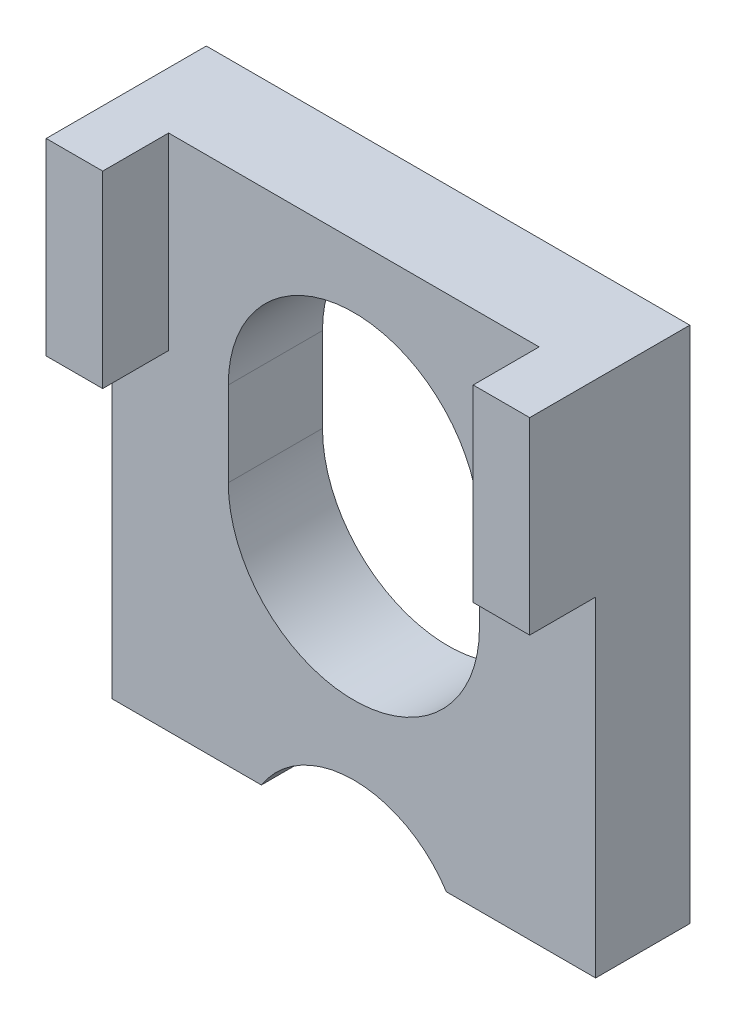
ISO-10303-21;
HEADER;
FILE_DESCRIPTION(('STEP AP214'),'2;1');
FILE_NAME('part.step','',(''),(''),'','','');
FILE_SCHEMA(('AUTOMOTIVE_DESIGN { 1 0 10303 214 1 1 1 1 }'));
ENDSEC;
DATA;
#1=APPLICATION_CONTEXT('core data for automotive mechanical design processes');
#2=APPLICATION_PROTOCOL_DEFINITION('international standard','automotive_design',2000,#1);
#3=PRODUCT_CONTEXT('',#1,'mechanical');
#4=PRODUCT('Part','Part','',(#3));
#5=PRODUCT_RELATED_PRODUCT_CATEGORY('part','',(#4));
#6=PRODUCT_DEFINITION_FORMATION('','',#4);
#7=PRODUCT_DEFINITION_CONTEXT('part definition',#1,'design');
#8=PRODUCT_DEFINITION('design','',#6,#7);
#9=PRODUCT_DEFINITION_SHAPE('','',#8);
#10=(LENGTH_UNIT() NAMED_UNIT(*) SI_UNIT(.MILLI.,.METRE.));
#11=(NAMED_UNIT(*) PLANE_ANGLE_UNIT() SI_UNIT($,.RADIAN.));
#12=(NAMED_UNIT(*) SI_UNIT($,.STERADIAN.) SOLID_ANGLE_UNIT());
#13=UNCERTAINTY_MEASURE_WITH_UNIT(LENGTH_MEASURE(1.E-05),#10,'distance_accuracy_value','');
#14=(GEOMETRIC_REPRESENTATION_CONTEXT(3) GLOBAL_UNCERTAINTY_ASSIGNED_CONTEXT((#13)) GLOBAL_UNIT_ASSIGNED_CONTEXT((#10,
#11,#12)) REPRESENTATION_CONTEXT('',''));
#15=CARTESIAN_POINT('',(0.,0.,0.));
#16=DIRECTION('',(0.,0.,1.));
#17=DIRECTION('',(1.,0.,0.));
#18=AXIS2_PLACEMENT_3D('',#15,#16,#17);
#19=CARTESIAN_POINT('',(0.,-4.65897627091936,3.));
#20=DIRECTION('',(0.,0.,-1.));
#21=DIRECTION('',(-1.,0.,0.));
#22=AXIS2_PLACEMENT_3D('',#19,#20,#21);
#23=PLANE('',#22);
#24=CARTESIAN_POINT('',(0.,7.73749960693732,3.));
#25=DIRECTION('',(0.,0.,1.));
#26=DIRECTION('',(1.,0.,0.));
#27=AXIS2_PLACEMENT_3D('',#24,#25,#26);
#28=CIRCLE('',#27,4.);
#29=CARTESIAN_POINT('',(4.,7.73749960693732,3.));
#30=VERTEX_POINT('',#29);
#31=CARTESIAN_POINT('',(-4.,7.73749960693732,3.));
#32=VERTEX_POINT('',#31);
#33=EDGE_CURVE('E211',#30,#32,#28,.T.);
#34=ORIENTED_EDGE('',*,*,#33,.F.);
#35=DIRECTION('',(0.,1.,0.));
#36=VECTOR('',#35,1.);
#37=CARTESIAN_POINT('',(4.,7.73749960693732,3.));
#38=LINE('',#37,#36);
#39=CARTESIAN_POINT('',(4.,5.04102372908064,3.));
#40=VERTEX_POINT('',#39);
#41=EDGE_CURVE('E219',#40,#30,#38,.T.);
#42=ORIENTED_EDGE('',*,*,#41,.F.);
#43=CARTESIAN_POINT('',(0.,5.04102372908064,3.));
#44=DIRECTION('',(0.,0.,1.));
#45=DIRECTION('',(1.,0.,0.));
#46=AXIS2_PLACEMENT_3D('',#43,#44,#45);
#47=CIRCLE('',#46,4.);
#48=CARTESIAN_POINT('',(-4.,5.04102372908064,3.));
#49=VERTEX_POINT('',#48);
#50=EDGE_CURVE('E216',#49,#40,#47,.T.);
#51=ORIENTED_EDGE('',*,*,#50,.F.);
#52=DIRECTION('',(0.,-1.,0.));
#53=VECTOR('',#52,1.);
#54=CARTESIAN_POINT('',(-4.,7.73749960693732,3.));
#55=LINE('',#54,#53);
#56=EDGE_CURVE('E213',#32,#49,#55,.T.);
#57=ORIENTED_EDGE('',*,*,#56,.F.);
#58=EDGE_LOOP('',(#34,#42,#51,#57));
#59=FACE_BOUND('',#58,.T.);
#60=DIRECTION('',(0.,-1.,0.));
#61=VECTOR('',#60,1.);
#62=CARTESIAN_POINT('',(5.9,13.7374996069373,3.));
#63=LINE('',#62,#61);
#64=CARTESIAN_POINT('',(5.9,13.7374996069373,3.));
#65=VERTEX_POINT('',#64);
#66=CARTESIAN_POINT('',(5.9,7.73749960693732,3.));
#67=VERTEX_POINT('',#66);
#68=EDGE_CURVE('E173',#65,#67,#63,.T.);
#69=ORIENTED_EDGE('',*,*,#68,.F.);
#70=DIRECTION('',(-1.,0.,0.));
#71=VECTOR('',#70,1.);
#72=CARTESIAN_POINT('',(-7.7,13.7374996069373,3.));
#73=LINE('',#72,#71);
#74=CARTESIAN_POINT('',(-5.9,13.7374996069373,3.));
#75=VERTEX_POINT('',#74);
#76=EDGE_CURVE('E252',#65,#75,#73,.T.);
#77=ORIENTED_EDGE('',*,*,#76,.T.);
#78=DIRECTION('',(0.,1.,0.));
#79=VECTOR('',#78,1.);
#80=CARTESIAN_POINT('',(-5.9,13.7374996069373,3.));
#81=LINE('',#80,#79);
#82=CARTESIAN_POINT('',(-5.9,7.73749960693732,3.));
#83=VERTEX_POINT('',#82);
#84=EDGE_CURVE('E190',#83,#75,#81,.T.);
#85=ORIENTED_EDGE('',*,*,#84,.F.);
#86=DIRECTION('',(1.,0.,0.));
#87=VECTOR('',#86,1.);
#88=CARTESIAN_POINT('',(-7.7,7.73749960693732,3.));
#89=LINE('',#88,#87);
#90=CARTESIAN_POINT('',(-7.7,7.73749960693732,3.));
#91=VERTEX_POINT('',#90);
#92=EDGE_CURVE('E185',#91,#83,#89,.T.);
#93=ORIENTED_EDGE('',*,*,#92,.F.);
#94=DIRECTION('',(0.,-1.,0.));
#95=VECTOR('',#94,1.);
#96=CARTESIAN_POINT('',(-7.7,13.7374996069373,3.));
#97=LINE('',#96,#95);
#98=CARTESIAN_POINT('',(-7.7,-2.76956685137603,3.));
#99=VERTEX_POINT('',#98);
#100=EDGE_CURVE('E242',#91,#99,#97,.T.);
#101=ORIENTED_EDGE('',*,*,#100,.T.);
#102=DIRECTION('',(1.,0.,0.));
#103=VECTOR('',#102,1.);
#104=CARTESIAN_POINT('',(-7.7,-2.76956685137603,3.));
#105=LINE('',#104,#103);
#106=CARTESIAN_POINT('',(-2.94620638200058,-2.76956685137603,3.));
#107=VERTEX_POINT('',#106);
#108=EDGE_CURVE('E244',#99,#107,#105,.T.);
#109=ORIENTED_EDGE('',*,*,#108,.T.);
#110=CARTESIAN_POINT('',(0.,-4.65897627091936,3.));
#111=DIRECTION('',(0.,0.,-1.));
#112=DIRECTION('',(-1.,0.,0.));
#113=AXIS2_PLACEMENT_3D('',#110,#111,#112);
#114=CIRCLE('',#113,3.5);
#115=CARTESIAN_POINT('',(2.94620638200058,-2.76956685137603,3.));
#116=VERTEX_POINT('',#115);
#117=EDGE_CURVE('E247',#107,#116,#114,.T.);
#118=ORIENTED_EDGE('',*,*,#117,.T.);
#119=DIRECTION('',(1.,0.,0.));
#120=VECTOR('',#119,1.);
#121=CARTESIAN_POINT('',(7.7,-2.76956685137603,3.));
#122=LINE('',#121,#120);
#123=CARTESIAN_POINT('',(7.7,-2.76956685137603,3.));
#124=VERTEX_POINT('',#123);
#125=EDGE_CURVE('E249',#116,#124,#122,.T.);
#126=ORIENTED_EDGE('',*,*,#125,.T.);
#127=DIRECTION('',(0.,1.,0.));
#128=VECTOR('',#127,1.);
#129=CARTESIAN_POINT('',(7.7,-0.0396047922675049,3.));
#130=LINE('',#129,#128);
#131=CARTESIAN_POINT('',(7.7,7.73749960693732,3.));
#132=VERTEX_POINT('',#131);
#133=EDGE_CURVE('E53',#124,#132,#130,.T.);
#134=ORIENTED_EDGE('',*,*,#133,.T.);
#135=DIRECTION('',(1.,0.,0.));
#136=VECTOR('',#135,1.);
#137=CARTESIAN_POINT('',(7.7,7.73749960693732,3.));
#138=LINE('',#137,#136);
#139=EDGE_CURVE('E48',#67,#132,#138,.T.);
#140=ORIENTED_EDGE('',*,*,#139,.F.);
#141=EDGE_LOOP('',(#69,#77,#85,#93,#101,#109,#118,#126,#134,#140));
#142=FACE_BOUND('',#141,.T.);
#143=ADVANCED_FACE('F33',(#59,#142),#23,.F.);
#144=CARTESIAN_POINT('',(0.,-4.65897627091936,0.));
#145=DIRECTION('',(0.,0.,-1.));
#146=DIRECTION('',(-1.,0.,0.));
#147=AXIS2_PLACEMENT_3D('',#144,#145,#146);
#148=PLANE('',#147);
#149=DIRECTION('',(0.,-1.,0.));
#150=VECTOR('',#149,1.);
#151=CARTESIAN_POINT('',(-7.7,-0.0396047922675089,0.));
#152=LINE('',#151,#150);
#153=CARTESIAN_POINT('',(-7.7,13.7374996069373,0.));
#154=VERTEX_POINT('',#153);
#155=CARTESIAN_POINT('',(-7.7,-2.76956685137603,0.));
#156=VERTEX_POINT('',#155);
#157=EDGE_CURVE('E241',#154,#156,#152,.T.);
#158=ORIENTED_EDGE('',*,*,#157,.F.);
#159=DIRECTION('',(-1.,0.,0.));
#160=VECTOR('',#159,1.);
#161=CARTESIAN_POINT('',(-7.7,13.7374996069373,0.));
#162=LINE('',#161,#160);
#163=CARTESIAN_POINT('',(7.7,13.7374996069373,0.));
#164=VERTEX_POINT('',#163);
#165=EDGE_CURVE('E245',#164,#154,#162,.T.);
#166=ORIENTED_EDGE('',*,*,#165,.F.);
#167=DIRECTION('',(0.,1.,0.));
#168=VECTOR('',#167,1.);
#169=CARTESIAN_POINT('',(7.7,13.7374996069373,0.));
#170=LINE('',#169,#168);
#171=CARTESIAN_POINT('',(7.7,-2.76956685137603,0.));
#172=VERTEX_POINT('',#171);
#173=EDGE_CURVE('E152',#172,#164,#170,.T.);
#174=ORIENTED_EDGE('',*,*,#173,.F.);
#175=DIRECTION('',(1.,0.,0.));
#176=VECTOR('',#175,1.);
#177=CARTESIAN_POINT('',(7.7,-2.76956685137603,0.));
#178=LINE('',#177,#176);
#179=CARTESIAN_POINT('',(2.94620638200058,-2.76956685137603,0.));
#180=VERTEX_POINT('',#179);
#181=EDGE_CURVE('E259',#180,#172,#178,.T.);
#182=ORIENTED_EDGE('',*,*,#181,.F.);
#183=CARTESIAN_POINT('',(0.,-4.65897627091936,0.));
#184=DIRECTION('',(0.,0.,-1.));
#185=DIRECTION('',(-1.,0.,0.));
#186=AXIS2_PLACEMENT_3D('',#183,#184,#185);
#187=CIRCLE('',#186,3.5);
#188=CARTESIAN_POINT('',(-2.94620638200058,-2.76956685137603,0.));
#189=VERTEX_POINT('',#188);
#190=EDGE_CURVE('E257',#189,#180,#187,.T.);
#191=ORIENTED_EDGE('',*,*,#190,.F.);
#192=DIRECTION('',(1.,0.,0.));
#193=VECTOR('',#192,1.);
#194=CARTESIAN_POINT('',(-7.7,-2.76956685137603,0.));
#195=LINE('',#194,#193);
#196=EDGE_CURVE('E255',#156,#189,#195,.T.);
#197=ORIENTED_EDGE('',*,*,#196,.F.);
#198=EDGE_LOOP('',(#158,#166,#174,#182,#191,#197));
#199=FACE_BOUND('',#198,.T.);
#200=DIRECTION('',(0.,1.,0.));
#201=VECTOR('',#200,1.);
#202=CARTESIAN_POINT('',(4.,7.73749960693732,0.));
#203=LINE('',#202,#201);
#204=CARTESIAN_POINT('',(4.,5.04102372908064,0.));
#205=VERTEX_POINT('',#204);
#206=CARTESIAN_POINT('',(4.,7.73749960693732,0.));
#207=VERTEX_POINT('',#206);
#208=EDGE_CURVE('E214',#205,#207,#203,.T.);
#209=ORIENTED_EDGE('',*,*,#208,.T.);
#210=CARTESIAN_POINT('',(0.,7.73749960693732,0.));
#211=DIRECTION('',(0.,0.,1.));
#212=DIRECTION('',(1.,0.,0.));
#213=AXIS2_PLACEMENT_3D('',#210,#211,#212);
#214=CIRCLE('',#213,4.);
#215=CARTESIAN_POINT('',(-4.,7.73749960693732,0.));
#216=VERTEX_POINT('',#215);
#217=EDGE_CURVE('E210',#207,#216,#214,.T.);
#218=ORIENTED_EDGE('',*,*,#217,.T.);
#219=DIRECTION('',(0.,-1.,0.));
#220=VECTOR('',#219,1.);
#221=CARTESIAN_POINT('',(-4.,7.73749960693732,0.));
#222=LINE('',#221,#220);
#223=CARTESIAN_POINT('',(-4.,5.04102372908064,0.));
#224=VERTEX_POINT('',#223);
#225=EDGE_CURVE('E224',#216,#224,#222,.T.);
#226=ORIENTED_EDGE('',*,*,#225,.T.);
#227=CARTESIAN_POINT('',(0.,5.04102372908064,0.));
#228=DIRECTION('',(0.,0.,1.));
#229=DIRECTION('',(1.,0.,0.));
#230=AXIS2_PLACEMENT_3D('',#227,#228,#229);
#231=CIRCLE('',#230,4.);
#232=EDGE_CURVE('E227',#224,#205,#231,.T.);
#233=ORIENTED_EDGE('',*,*,#232,.T.);
#234=EDGE_LOOP('',(#209,#218,#226,#233));
#235=FACE_BOUND('',#234,.T.);
#236=ADVANCED_FACE('F281',(#199,#235),#148,.T.);
#237=CARTESIAN_POINT('',(-7.7,-0.0396047922675089,3.));
#238=DIRECTION('',(1.,0.,0.));
#239=DIRECTION('',(0.,0.,-1.));
#240=AXIS2_PLACEMENT_3D('',#237,#238,#239);
#241=PLANE('',#240);
#242=ORIENTED_EDGE('',*,*,#157,.T.);
#243=DIRECTION('',(0.,0.,-1.));
#244=VECTOR('',#243,1.);
#245=CARTESIAN_POINT('',(-7.7,-2.76956685137603,3.));
#246=LINE('',#245,#244);
#247=EDGE_CURVE('E11',#99,#156,#246,.T.);
#248=ORIENTED_EDGE('',*,*,#247,.F.);
#249=ORIENTED_EDGE('',*,*,#100,.F.);
#250=DIRECTION('',(0.,0.,-1.));
#251=VECTOR('',#250,1.);
#252=CARTESIAN_POINT('',(-7.7,7.73749960693732,5.1));
#253=LINE('',#252,#251);
#254=CARTESIAN_POINT('',(-7.7,7.73749960693732,5.1));
#255=VERTEX_POINT('',#254);
#256=EDGE_CURVE('E207',#255,#91,#253,.T.);
#257=ORIENTED_EDGE('',*,*,#256,.F.);
#258=DIRECTION('',(0.,-1.,0.));
#259=VECTOR('',#258,1.);
#260=CARTESIAN_POINT('',(-7.7,13.7374996069373,5.1));
#261=LINE('',#260,#259);
#262=CARTESIAN_POINT('',(-7.7,13.7374996069373,5.1));
#263=VERTEX_POINT('',#262);
#264=EDGE_CURVE('E186',#263,#255,#261,.T.);
#265=ORIENTED_EDGE('',*,*,#264,.F.);
#266=DIRECTION('',(0.,0.,-1.));
#267=VECTOR('',#266,1.);
#268=CARTESIAN_POINT('',(-7.7,13.7374996069373,3.));
#269=LINE('',#268,#267);
#270=EDGE_CURVE('E157',#263,#154,#269,.T.);
#271=ORIENTED_EDGE('',*,*,#270,.T.);
#272=EDGE_LOOP('',(#242,#248,#249,#257,#265,#271));
#273=FACE_BOUND('',#272,.T.);
#274=ADVANCED_FACE('F35',(#273),#241,.F.);
#275=CARTESIAN_POINT('',(-7.7,-2.76956685137603,3.));
#276=DIRECTION('',(0.,1.,0.));
#277=DIRECTION('',(0.,0.,1.));
#278=AXIS2_PLACEMENT_3D('',#275,#276,#277);
#279=PLANE('',#278);
#280=ORIENTED_EDGE('',*,*,#196,.T.);
#281=DIRECTION('',(0.,0.,-1.));
#282=VECTOR('',#281,1.);
#283=CARTESIAN_POINT('',(-2.94620638200058,-2.76956685137603,3.));
#284=LINE('',#283,#282);
#285=EDGE_CURVE('E41',#107,#189,#284,.T.);
#286=ORIENTED_EDGE('',*,*,#285,.F.);
#287=ORIENTED_EDGE('',*,*,#108,.F.);
#288=ORIENTED_EDGE('',*,*,#247,.T.);
#289=EDGE_LOOP('',(#280,#286,#287,#288));
#290=FACE_BOUND('',#289,.T.);
#291=ADVANCED_FACE('F307',(#290),#279,.F.);
#292=CARTESIAN_POINT('',(0.,-4.65897627091936,3.));
#293=DIRECTION('',(0.,0.,-1.));
#294=DIRECTION('',(-1.,0.,0.));
#295=AXIS2_PLACEMENT_3D('',#292,#293,#294);
#296=CYLINDRICAL_SURFACE('',#295,3.5);
#297=ORIENTED_EDGE('',*,*,#190,.T.);
#298=DIRECTION('',(0.,0.,-1.));
#299=VECTOR('',#298,1.);
#300=CARTESIAN_POINT('',(2.94620638200058,-2.76956685137603,3.));
#301=LINE('',#300,#299);
#302=EDGE_CURVE('E267',#116,#180,#301,.T.);
#303=ORIENTED_EDGE('',*,*,#302,.F.);
#304=ORIENTED_EDGE('',*,*,#117,.F.);
#305=ORIENTED_EDGE('',*,*,#285,.T.);
#306=EDGE_LOOP('',(#297,#303,#304,#305));
#307=FACE_BOUND('',#306,.T.);
#308=ADVANCED_FACE('F274',(#307),#296,.F.);
#309=CARTESIAN_POINT('',(7.7,-2.76956685137603,3.));
#310=DIRECTION('',(0.,1.,0.));
#311=DIRECTION('',(-1.,0.,0.));
#312=AXIS2_PLACEMENT_3D('',#309,#310,#311);
#313=PLANE('',#312);
#314=ORIENTED_EDGE('',*,*,#181,.T.);
#315=DIRECTION('',(0.,0.,-1.));
#316=VECTOR('',#315,1.);
#317=CARTESIAN_POINT('',(7.7,-2.76956685137603,3.));
#318=LINE('',#317,#316);
#319=EDGE_CURVE('E156',#124,#172,#318,.T.);
#320=ORIENTED_EDGE('',*,*,#319,.F.);
#321=ORIENTED_EDGE('',*,*,#125,.F.);
#322=ORIENTED_EDGE('',*,*,#302,.T.);
#323=EDGE_LOOP('',(#314,#320,#321,#322));
#324=FACE_BOUND('',#323,.T.);
#325=ADVANCED_FACE('F285',(#324),#313,.F.);
#326=CARTESIAN_POINT('',(7.7,13.7374996069373,3.));
#327=DIRECTION('',(-1.,0.,0.));
#328=DIRECTION('',(0.,-1.,0.));
#329=AXIS2_PLACEMENT_3D('',#326,#327,#328);
#330=PLANE('',#329);
#331=ORIENTED_EDGE('',*,*,#173,.T.);
#332=DIRECTION('',(0.,0.,-1.));
#333=VECTOR('',#332,1.);
#334=CARTESIAN_POINT('',(7.7,13.7374996069373,3.));
#335=LINE('',#334,#333);
#336=CARTESIAN_POINT('',(7.7,13.7374996069373,5.1));
#337=VERTEX_POINT('',#336);
#338=EDGE_CURVE('E145',#337,#164,#335,.T.);
#339=ORIENTED_EDGE('',*,*,#338,.F.);
#340=DIRECTION('',(0.,1.,0.));
#341=VECTOR('',#340,1.);
#342=CARTESIAN_POINT('',(7.7,13.7374996069373,5.1));
#343=LINE('',#342,#341);
#344=CARTESIAN_POINT('',(7.7,7.73749960693732,5.1));
#345=VERTEX_POINT('',#344);
#346=EDGE_CURVE('E150',#345,#337,#343,.T.);
#347=ORIENTED_EDGE('',*,*,#346,.F.);
#348=DIRECTION('',(0.,0.,-1.));
#349=VECTOR('',#348,1.);
#350=CARTESIAN_POINT('',(7.7,7.73749960693732,5.1));
#351=LINE('',#350,#349);
#352=EDGE_CURVE('E178',#345,#132,#351,.T.);
#353=ORIENTED_EDGE('',*,*,#352,.T.);
#354=ORIENTED_EDGE('',*,*,#133,.F.);
#355=ORIENTED_EDGE('',*,*,#319,.T.);
#356=EDGE_LOOP('',(#331,#339,#347,#353,#354,#355));
#357=FACE_BOUND('',#356,.T.);
#358=ADVANCED_FACE('F147',(#357),#330,.F.);
#359=CARTESIAN_POINT('',(-7.7,13.7374996069373,3.));
#360=DIRECTION('',(0.,-1.,0.));
#361=DIRECTION('',(0.,0.,-1.));
#362=AXIS2_PLACEMENT_3D('',#359,#360,#361);
#363=PLANE('',#362);
#364=ORIENTED_EDGE('',*,*,#165,.T.);
#365=ORIENTED_EDGE('',*,*,#270,.F.);
#366=DIRECTION('',(-1.,0.,0.));
#367=VECTOR('',#366,1.);
#368=CARTESIAN_POINT('',(-7.7,13.7374996069373,5.1));
#369=LINE('',#368,#367);
#370=CARTESIAN_POINT('',(-5.9,13.7374996069373,5.1));
#371=VERTEX_POINT('',#370);
#372=EDGE_CURVE('E194',#371,#263,#369,.T.);
#373=ORIENTED_EDGE('',*,*,#372,.F.);
#374=DIRECTION('',(0.,0.,-1.));
#375=VECTOR('',#374,1.);
#376=CARTESIAN_POINT('',(-5.9,13.7374996069373,5.1));
#377=LINE('',#376,#375);
#378=EDGE_CURVE('E197',#371,#75,#377,.T.);
#379=ORIENTED_EDGE('',*,*,#378,.T.);
#380=ORIENTED_EDGE('',*,*,#76,.F.);
#381=DIRECTION('',(0.,0.,-1.));
#382=VECTOR('',#381,1.);
#383=CARTESIAN_POINT('',(5.9,13.7374996069373,5.1));
#384=LINE('',#383,#382);
#385=CARTESIAN_POINT('',(5.9,13.7374996069373,5.1));
#386=VERTEX_POINT('',#385);
#387=EDGE_CURVE('E163',#386,#65,#384,.T.);
#388=ORIENTED_EDGE('',*,*,#387,.F.);
#389=DIRECTION('',(-1.,0.,0.));
#390=VECTOR('',#389,1.);
#391=CARTESIAN_POINT('',(7.7,13.7374996069373,5.1));
#392=LINE('',#391,#390);
#393=EDGE_CURVE('E160',#337,#386,#392,.T.);
#394=ORIENTED_EDGE('',*,*,#393,.F.);
#395=ORIENTED_EDGE('',*,*,#338,.T.);
#396=EDGE_LOOP('',(#364,#365,#373,#379,#380,#388,#394,#395));
#397=FACE_BOUND('',#396,.T.);
#398=ADVANCED_FACE('F161',(#397),#363,.F.);
#399=CARTESIAN_POINT('',(0.,7.73749960693732,3.));
#400=DIRECTION('',(0.,0.,-1.));
#401=DIRECTION('',(-1.,0.,0.));
#402=AXIS2_PLACEMENT_3D('',#399,#400,#401);
#403=CYLINDRICAL_SURFACE('',#402,4.);
#404=ORIENTED_EDGE('',*,*,#217,.F.);
#405=DIRECTION('',(0.,0.,-1.));
#406=VECTOR('',#405,1.);
#407=CARTESIAN_POINT('',(4.,7.73749960693732,3.));
#408=LINE('',#407,#406);
#409=EDGE_CURVE('E221',#30,#207,#408,.T.);
#410=ORIENTED_EDGE('',*,*,#409,.F.);
#411=ORIENTED_EDGE('',*,*,#33,.T.);
#412=DIRECTION('',(0.,0.,-1.));
#413=VECTOR('',#412,1.);
#414=CARTESIAN_POINT('',(-4.,7.73749960693732,3.));
#415=LINE('',#414,#413);
#416=EDGE_CURVE('E238',#32,#216,#415,.T.);
#417=ORIENTED_EDGE('',*,*,#416,.T.);
#418=EDGE_LOOP('',(#404,#410,#411,#417));
#419=FACE_BOUND('',#418,.T.);
#420=ADVANCED_FACE('F323',(#419),#403,.F.);
#421=CARTESIAN_POINT('',(-4.,7.73749960693732,3.));
#422=DIRECTION('',(1.,0.,0.));
#423=DIRECTION('',(0.,1.,0.));
#424=AXIS2_PLACEMENT_3D('',#421,#422,#423);
#425=PLANE('',#424);
#426=ORIENTED_EDGE('',*,*,#225,.F.);
#427=ORIENTED_EDGE('',*,*,#416,.F.);
#428=ORIENTED_EDGE('',*,*,#56,.T.);
#429=DIRECTION('',(0.,0.,-1.));
#430=VECTOR('',#429,1.);
#431=CARTESIAN_POINT('',(-4.,5.04102372908064,3.));
#432=LINE('',#431,#430);
#433=EDGE_CURVE('E236',#49,#224,#432,.T.);
#434=ORIENTED_EDGE('',*,*,#433,.T.);
#435=EDGE_LOOP('',(#426,#427,#428,#434));
#436=FACE_BOUND('',#435,.T.);
#437=ADVANCED_FACE('F351',(#436),#425,.T.);
#438=CARTESIAN_POINT('',(0.,5.04102372908064,3.));
#439=DIRECTION('',(0.,0.,-1.));
#440=DIRECTION('',(-1.,0.,0.));
#441=AXIS2_PLACEMENT_3D('',#438,#439,#440);
#442=CYLINDRICAL_SURFACE('',#441,4.);
#443=ORIENTED_EDGE('',*,*,#232,.F.);
#444=ORIENTED_EDGE('',*,*,#433,.F.);
#445=ORIENTED_EDGE('',*,*,#50,.T.);
#446=DIRECTION('',(0.,0.,-1.));
#447=VECTOR('',#446,1.);
#448=CARTESIAN_POINT('',(4.,5.04102372908064,3.));
#449=LINE('',#448,#447);
#450=EDGE_CURVE('E234',#40,#205,#449,.T.);
#451=ORIENTED_EDGE('',*,*,#450,.T.);
#452=EDGE_LOOP('',(#443,#444,#445,#451));
#453=FACE_BOUND('',#452,.T.);
#454=ADVANCED_FACE('F358',(#453),#442,.F.);
#455=CARTESIAN_POINT('',(4.,7.73749960693732,3.));
#456=DIRECTION('',(-1.,0.,0.));
#457=DIRECTION('',(0.,-1.,0.));
#458=AXIS2_PLACEMENT_3D('',#455,#456,#457);
#459=PLANE('',#458);
#460=ORIENTED_EDGE('',*,*,#208,.F.);
#461=ORIENTED_EDGE('',*,*,#450,.F.);
#462=ORIENTED_EDGE('',*,*,#41,.T.);
#463=ORIENTED_EDGE('',*,*,#409,.T.);
#464=EDGE_LOOP('',(#460,#461,#462,#463));
#465=FACE_BOUND('',#464,.T.);
#466=ADVANCED_FACE('F365',(#465),#459,.T.);
#467=CARTESIAN_POINT('',(-7.7,7.73749960693732,5.1));
#468=DIRECTION('',(0.,1.,0.));
#469=DIRECTION('',(0.,0.,1.));
#470=AXIS2_PLACEMENT_3D('',#467,#468,#469);
#471=PLANE('',#470);
#472=ORIENTED_EDGE('',*,*,#92,.T.);
#473=DIRECTION('',(0.,0.,-1.));
#474=VECTOR('',#473,1.);
#475=CARTESIAN_POINT('',(-5.9,7.73749960693732,5.1));
#476=LINE('',#475,#474);
#477=CARTESIAN_POINT('',(-5.9,7.73749960693732,5.1));
#478=VERTEX_POINT('',#477);
#479=EDGE_CURVE('E204',#478,#83,#476,.T.);
#480=ORIENTED_EDGE('',*,*,#479,.F.);
#481=DIRECTION('',(1.,0.,0.));
#482=VECTOR('',#481,1.);
#483=CARTESIAN_POINT('',(-7.7,7.73749960693732,5.1));
#484=LINE('',#483,#482);
#485=EDGE_CURVE('E189',#255,#478,#484,.T.);
#486=ORIENTED_EDGE('',*,*,#485,.F.);
#487=ORIENTED_EDGE('',*,*,#256,.T.);
#488=EDGE_LOOP('',(#472,#480,#486,#487));
#489=FACE_BOUND('',#488,.T.);
#490=ADVANCED_FACE('F306',(#489),#471,.F.);
#491=CARTESIAN_POINT('',(-5.9,13.7374996069373,5.1));
#492=DIRECTION('',(-1.,0.,0.));
#493=DIRECTION('',(0.,-1.,0.));
#494=AXIS2_PLACEMENT_3D('',#491,#492,#493);
#495=PLANE('',#494);
#496=ORIENTED_EDGE('',*,*,#84,.T.);
#497=ORIENTED_EDGE('',*,*,#378,.F.);
#498=DIRECTION('',(0.,1.,0.));
#499=VECTOR('',#498,1.);
#500=CARTESIAN_POINT('',(-5.9,13.7374996069373,5.1));
#501=LINE('',#500,#499);
#502=EDGE_CURVE('E192',#478,#371,#501,.T.);
#503=ORIENTED_EDGE('',*,*,#502,.F.);
#504=ORIENTED_EDGE('',*,*,#479,.T.);
#505=EDGE_LOOP('',(#496,#497,#503,#504));
#506=FACE_BOUND('',#505,.T.);
#507=ADVANCED_FACE('F294',(#506),#495,.F.);
#508=CARTESIAN_POINT('',(0.,0.,5.1));
#509=DIRECTION('',(0.,0.,1.));
#510=DIRECTION('',(1.,0.,0.));
#511=AXIS2_PLACEMENT_3D('',#508,#509,#510);
#512=PLANE('',#511);
#513=ORIENTED_EDGE('',*,*,#264,.T.);
#514=ORIENTED_EDGE('',*,*,#485,.T.);
#515=ORIENTED_EDGE('',*,*,#502,.T.);
#516=ORIENTED_EDGE('',*,*,#372,.T.);
#517=EDGE_LOOP('',(#513,#514,#515,#516));
#518=FACE_BOUND('',#517,.T.);
#519=ADVANCED_FACE('F300',(#518),#512,.T.);
#520=CARTESIAN_POINT('',(5.9,13.7374996069373,5.1));
#521=DIRECTION('',(1.,0.,0.));
#522=DIRECTION('',(0.,1.,0.));
#523=AXIS2_PLACEMENT_3D('',#520,#521,#522);
#524=PLANE('',#523);
#525=ORIENTED_EDGE('',*,*,#68,.T.);
#526=DIRECTION('',(0.,0.,-1.));
#527=VECTOR('',#526,1.);
#528=CARTESIAN_POINT('',(5.9,7.73749960693732,5.1));
#529=LINE('',#528,#527);
#530=CARTESIAN_POINT('',(5.9,7.73749960693732,5.1));
#531=VERTEX_POINT('',#530);
#532=EDGE_CURVE('E181',#531,#67,#529,.T.);
#533=ORIENTED_EDGE('',*,*,#532,.F.);
#534=DIRECTION('',(0.,-1.,0.));
#535=VECTOR('',#534,1.);
#536=CARTESIAN_POINT('',(5.9,13.7374996069373,5.1));
#537=LINE('',#536,#535);
#538=EDGE_CURVE('E166',#386,#531,#537,.T.);
#539=ORIENTED_EDGE('',*,*,#538,.F.);
#540=ORIENTED_EDGE('',*,*,#387,.T.);
#541=EDGE_LOOP('',(#525,#533,#539,#540));
#542=FACE_BOUND('',#541,.T.);
#543=ADVANCED_FACE('F291',(#542),#524,.F.);
#544=CARTESIAN_POINT('',(7.7,7.73749960693732,5.1));
#545=DIRECTION('',(0.,1.,0.));
#546=DIRECTION('',(0.,0.,1.));
#547=AXIS2_PLACEMENT_3D('',#544,#545,#546);
#548=PLANE('',#547);
#549=ORIENTED_EDGE('',*,*,#139,.T.);
#550=ORIENTED_EDGE('',*,*,#352,.F.);
#551=DIRECTION('',(1.,0.,0.));
#552=VECTOR('',#551,1.);
#553=CARTESIAN_POINT('',(7.7,7.73749960693732,5.1));
#554=LINE('',#553,#552);
#555=EDGE_CURVE('E170',#531,#345,#554,.T.);
#556=ORIENTED_EDGE('',*,*,#555,.F.);
#557=ORIENTED_EDGE('',*,*,#532,.T.);
#558=EDGE_LOOP('',(#549,#550,#556,#557));
#559=FACE_BOUND('',#558,.T.);
#560=ADVANCED_FACE('F288',(#559),#548,.F.);
#561=CARTESIAN_POINT('',(0.,0.,5.1));
#562=DIRECTION('',(0.,0.,-1.));
#563=DIRECTION('',(-1.,0.,0.));
#564=AXIS2_PLACEMENT_3D('',#561,#562,#563);
#565=PLANE('',#564);
#566=ORIENTED_EDGE('',*,*,#346,.T.);
#567=ORIENTED_EDGE('',*,*,#393,.T.);
#568=ORIENTED_EDGE('',*,*,#538,.T.);
#569=ORIENTED_EDGE('',*,*,#555,.T.);
#570=EDGE_LOOP('',(#566,#567,#568,#569));
#571=FACE_BOUND('',#570,.T.);
#572=ADVANCED_FACE('F168',(#571),#565,.F.);
#573=CLOSED_SHELL('',(#143,#236,#274,#291,#308,#325,#358,#398,#420,#437,#454,#466,#490,#507,
#519,#543,#560,#572));
#574=MANIFOLD_SOLID_BREP('B2',#573);
#575=ADVANCED_BREP_SHAPE_REPRESENTATION('',(#18,#574),#14);
#576=SHAPE_DEFINITION_REPRESENTATION(#9,#575);
ENDSEC;
END-ISO-10303-21;
